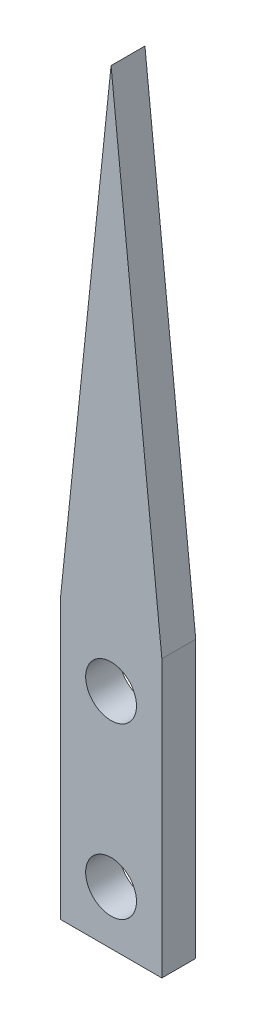
ISO-10303-21;
HEADER;
FILE_DESCRIPTION(('STEP AP214'),'2;1');
FILE_NAME('part.step','',(''),(''),'','','');
FILE_SCHEMA(('AUTOMOTIVE_DESIGN { 1 0 10303 214 1 1 1 1 }'));
ENDSEC;
DATA;
#1=APPLICATION_CONTEXT('core data for automotive mechanical design processes');
#2=APPLICATION_PROTOCOL_DEFINITION('international standard','automotive_design',2000,#1);
#3=PRODUCT_CONTEXT('',#1,'mechanical');
#4=PRODUCT('Part','Part','',(#3));
#5=PRODUCT_RELATED_PRODUCT_CATEGORY('part','',(#4));
#6=PRODUCT_DEFINITION_FORMATION('','',#4);
#7=PRODUCT_DEFINITION_CONTEXT('part definition',#1,'design');
#8=PRODUCT_DEFINITION('design','',#6,#7);
#9=PRODUCT_DEFINITION_SHAPE('','',#8);
#10=(LENGTH_UNIT() NAMED_UNIT(*) SI_UNIT(.MILLI.,.METRE.));
#11=(NAMED_UNIT(*) PLANE_ANGLE_UNIT() SI_UNIT($,.RADIAN.));
#12=(NAMED_UNIT(*) SI_UNIT($,.STERADIAN.) SOLID_ANGLE_UNIT());
#13=UNCERTAINTY_MEASURE_WITH_UNIT(LENGTH_MEASURE(1.E-05),#10,'distance_accuracy_value','');
#14=(GEOMETRIC_REPRESENTATION_CONTEXT(3) GLOBAL_UNCERTAINTY_ASSIGNED_CONTEXT((#13)) GLOBAL_UNIT_ASSIGNED_CONTEXT((#10,
#11,#12)) REPRESENTATION_CONTEXT('',''));
#15=CARTESIAN_POINT('',(0.,0.,0.));
#16=DIRECTION('',(0.,0.,1.));
#17=DIRECTION('',(1.,0.,0.));
#18=AXIS2_PLACEMENT_3D('',#15,#16,#17);
#19=CARTESIAN_POINT('',(0.,0.,2.));
#20=DIRECTION('',(0.,0.,-1.));
#21=DIRECTION('',(-1.,0.,0.));
#22=AXIS2_PLACEMENT_3D('',#19,#20,#21);
#23=PLANE('',#22);
#24=DIRECTION('',(-0.103478750023538,-0.994631664634485,0.));
#25=VECTOR('',#24,1.);
#26=CARTESIAN_POINT('',(0.,32.,2.));
#27=LINE('',#26,#25);
#28=CARTESIAN_POINT('',(0.,32.,2.));
#29=VERTEX_POINT('',#28);
#30=CARTESIAN_POINT('',(-3.,3.1641762852305,2.));
#31=VERTEX_POINT('',#30);
#32=EDGE_CURVE('E117',#29,#31,#27,.T.);
#33=ORIENTED_EDGE('',*,*,#32,.T.);
#34=DIRECTION('',(0.,-1.,0.));
#35=VECTOR('',#34,1.);
#36=CARTESIAN_POINT('',(-3.,3.1641762852305,2.));
#37=LINE('',#36,#35);
#38=CARTESIAN_POINT('',(-3.,-13.1641762852305,2.));
#39=VERTEX_POINT('',#38);
#40=EDGE_CURVE('E84',#31,#39,#37,.T.);
#41=ORIENTED_EDGE('',*,*,#40,.T.);
#42=DIRECTION('',(1.,0.,0.));
#43=VECTOR('',#42,1.);
#44=CARTESIAN_POINT('',(3.,-13.1641762852305,2.));
#45=LINE('',#44,#43);
#46=CARTESIAN_POINT('',(3.,-13.1641762852305,2.));
#47=VERTEX_POINT('',#46);
#48=EDGE_CURVE('E88',#39,#47,#45,.T.);
#49=ORIENTED_EDGE('',*,*,#48,.T.);
#50=DIRECTION('',(0.,1.,0.));
#51=VECTOR('',#50,1.);
#52=CARTESIAN_POINT('',(3.,3.16417628523051,2.));
#53=LINE('',#52,#51);
#54=CARTESIAN_POINT('',(3.,3.16417628523051,2.));
#55=VERTEX_POINT('',#54);
#56=EDGE_CURVE('E92',#47,#55,#53,.T.);
#57=ORIENTED_EDGE('',*,*,#56,.T.);
#58=DIRECTION('',(-0.103478750023538,0.994631664634485,0.));
#59=VECTOR('',#58,1.);
#60=CARTESIAN_POINT('',(3.,3.16417628523051,2.));
#61=LINE('',#60,#59);
#62=EDGE_CURVE('E50',#55,#29,#61,.T.);
#63=ORIENTED_EDGE('',*,*,#62,.T.);
#64=EDGE_LOOP('',(#33,#41,#49,#57,#63));
#65=FACE_BOUND('',#64,.T.);
#66=CARTESIAN_POINT('',(0.,0.,2.));
#67=DIRECTION('',(0.,0.,1.));
#68=DIRECTION('',(1.,0.,0.));
#69=AXIS2_PLACEMENT_3D('',#66,#67,#68);
#70=CIRCLE('',#69,1.5);
#71=CARTESIAN_POINT('',(1.5,0.,2.));
#72=VERTEX_POINT('',#71);
#73=EDGE_CURVE('E112',#72,#72,#70,.T.);
#74=ORIENTED_EDGE('',*,*,#73,.F.);
#75=EDGE_LOOP('',(#74));
#76=FACE_BOUND('',#75,.T.);
#77=CARTESIAN_POINT('',(0.,-10.,2.));
#78=DIRECTION('',(0.,0.,1.));
#79=DIRECTION('',(1.,0.,0.));
#80=AXIS2_PLACEMENT_3D('',#77,#78,#79);
#81=CIRCLE('',#80,1.5);
#82=CARTESIAN_POINT('',(1.5,-10.,2.));
#83=VERTEX_POINT('',#82);
#84=EDGE_CURVE('E153',#83,#83,#81,.T.);
#85=ORIENTED_EDGE('',*,*,#84,.F.);
#86=EDGE_LOOP('',(#85));
#87=FACE_BOUND('',#86,.T.);
#88=ADVANCED_FACE('F33',(#65,#76,#87),#23,.F.);
#89=CARTESIAN_POINT('',(0.,0.,0.));
#90=DIRECTION('',(0.,0.,-1.));
#91=DIRECTION('',(-1.,0.,0.));
#92=AXIS2_PLACEMENT_3D('',#89,#90,#91);
#93=PLANE('',#92);
#94=CARTESIAN_POINT('',(0.,0.,0.));
#95=DIRECTION('',(0.,0.,1.));
#96=DIRECTION('',(1.,0.,0.));
#97=AXIS2_PLACEMENT_3D('',#94,#95,#96);
#98=CIRCLE('',#97,1.5);
#99=CARTESIAN_POINT('',(1.5,0.,0.));
#100=VERTEX_POINT('',#99);
#101=EDGE_CURVE('E158',#100,#100,#98,.T.);
#102=ORIENTED_EDGE('',*,*,#101,.T.);
#103=EDGE_LOOP('',(#102));
#104=FACE_BOUND('',#103,.T.);
#105=DIRECTION('',(-0.103478750023538,-0.994631664634485,0.));
#106=VECTOR('',#105,1.);
#107=CARTESIAN_POINT('',(0.,32.,0.));
#108=LINE('',#107,#106);
#109=CARTESIAN_POINT('',(0.,32.,0.));
#110=VERTEX_POINT('',#109);
#111=CARTESIAN_POINT('',(-3.,3.1641762852305,0.));
#112=VERTEX_POINT('',#111);
#113=EDGE_CURVE('E108',#110,#112,#108,.T.);
#114=ORIENTED_EDGE('',*,*,#113,.F.);
#115=DIRECTION('',(-0.103478750023538,0.994631664634485,0.));
#116=VECTOR('',#115,1.);
#117=CARTESIAN_POINT('',(3.,3.16417628523051,0.));
#118=LINE('',#117,#116);
#119=CARTESIAN_POINT('',(3.,3.16417628523051,0.));
#120=VERTEX_POINT('',#119);
#121=EDGE_CURVE('E76',#120,#110,#118,.T.);
#122=ORIENTED_EDGE('',*,*,#121,.F.);
#123=DIRECTION('',(0.,1.,0.));
#124=VECTOR('',#123,1.);
#125=CARTESIAN_POINT('',(3.,3.16417628523051,0.));
#126=LINE('',#125,#124);
#127=CARTESIAN_POINT('',(3.,-13.1641762852305,0.));
#128=VERTEX_POINT('',#127);
#129=EDGE_CURVE('E70',#128,#120,#126,.T.);
#130=ORIENTED_EDGE('',*,*,#129,.F.);
#131=DIRECTION('',(1.,0.,0.));
#132=VECTOR('',#131,1.);
#133=CARTESIAN_POINT('',(3.,-13.1641762852305,0.));
#134=LINE('',#133,#132);
#135=CARTESIAN_POINT('',(-3.,-13.1641762852305,0.));
#136=VERTEX_POINT('',#135);
#137=EDGE_CURVE('E99',#136,#128,#134,.T.);
#138=ORIENTED_EDGE('',*,*,#137,.F.);
#139=DIRECTION('',(0.,-1.,0.));
#140=VECTOR('',#139,1.);
#141=CARTESIAN_POINT('',(-3.,3.1641762852305,0.));
#142=LINE('',#141,#140);
#143=EDGE_CURVE('E111',#112,#136,#142,.T.);
#144=ORIENTED_EDGE('',*,*,#143,.F.);
#145=EDGE_LOOP('',(#114,#122,#130,#138,#144));
#146=FACE_BOUND('',#145,.T.);
#147=CARTESIAN_POINT('',(0.,-10.,0.));
#148=DIRECTION('',(0.,0.,1.));
#149=DIRECTION('',(1.,0.,0.));
#150=AXIS2_PLACEMENT_3D('',#147,#148,#149);
#151=CIRCLE('',#150,1.5);
#152=CARTESIAN_POINT('',(1.5,-10.,0.));
#153=VERTEX_POINT('',#152);
#154=EDGE_CURVE('E156',#153,#153,#151,.T.);
#155=ORIENTED_EDGE('',*,*,#154,.T.);
#156=EDGE_LOOP('',(#155));
#157=FACE_BOUND('',#156,.T.);
#158=ADVANCED_FACE('F121',(#104,#146,#157),#93,.T.);
#159=CARTESIAN_POINT('',(0.,32.,2.));
#160=DIRECTION('',(0.994631664634485,-0.103478750023538,0.));
#161=DIRECTION('',(0.103478750023538,0.994631664634485,0.));
#162=AXIS2_PLACEMENT_3D('',#159,#160,#161);
#163=PLANE('',#162);
#164=ORIENTED_EDGE('',*,*,#113,.T.);
#165=DIRECTION('',(0.,0.,-1.));
#166=VECTOR('',#165,1.);
#167=CARTESIAN_POINT('',(-3.,3.1641762852305,2.));
#168=LINE('',#167,#166);
#169=EDGE_CURVE('E11',#31,#112,#168,.T.);
#170=ORIENTED_EDGE('',*,*,#169,.F.);
#171=ORIENTED_EDGE('',*,*,#32,.F.);
#172=DIRECTION('',(0.,0.,-1.));
#173=VECTOR('',#172,1.);
#174=CARTESIAN_POINT('',(0.,32.,2.));
#175=LINE('',#174,#173);
#176=EDGE_CURVE('E104',#29,#110,#175,.T.);
#177=ORIENTED_EDGE('',*,*,#176,.T.);
#178=EDGE_LOOP('',(#164,#170,#171,#177));
#179=FACE_BOUND('',#178,.T.);
#180=ADVANCED_FACE('F35',(#179),#163,.F.);
#181=CARTESIAN_POINT('',(-3.,3.1641762852305,2.));
#182=DIRECTION('',(1.,0.,0.));
#183=DIRECTION('',(0.,1.,0.));
#184=AXIS2_PLACEMENT_3D('',#181,#182,#183);
#185=PLANE('',#184);
#186=ORIENTED_EDGE('',*,*,#143,.T.);
#187=DIRECTION('',(0.,0.,-1.));
#188=VECTOR('',#187,1.);
#189=CARTESIAN_POINT('',(-3.,-13.1641762852305,2.));
#190=LINE('',#189,#188);
#191=EDGE_CURVE('E42',#39,#136,#190,.T.);
#192=ORIENTED_EDGE('',*,*,#191,.F.);
#193=ORIENTED_EDGE('',*,*,#40,.F.);
#194=ORIENTED_EDGE('',*,*,#169,.T.);
#195=EDGE_LOOP('',(#186,#192,#193,#194));
#196=FACE_BOUND('',#195,.T.);
#197=ADVANCED_FACE('F192',(#196),#185,.F.);
#198=CARTESIAN_POINT('',(3.,-13.1641762852305,2.));
#199=DIRECTION('',(0.,1.,0.));
#200=DIRECTION('',(-1.,0.,0.));
#201=AXIS2_PLACEMENT_3D('',#198,#199,#200);
#202=PLANE('',#201);
#203=ORIENTED_EDGE('',*,*,#137,.T.);
#204=DIRECTION('',(0.,0.,-1.));
#205=VECTOR('',#204,1.);
#206=CARTESIAN_POINT('',(3.,-13.1641762852305,2.));
#207=LINE('',#206,#205);
#208=EDGE_CURVE('E96',#47,#128,#207,.T.);
#209=ORIENTED_EDGE('',*,*,#208,.F.);
#210=ORIENTED_EDGE('',*,*,#48,.F.);
#211=ORIENTED_EDGE('',*,*,#191,.T.);
#212=EDGE_LOOP('',(#203,#209,#210,#211));
#213=FACE_BOUND('',#212,.T.);
#214=ADVANCED_FACE('F97',(#213),#202,.F.);
#215=CARTESIAN_POINT('',(3.,3.16417628523051,2.));
#216=DIRECTION('',(-1.,0.,0.));
#217=DIRECTION('',(0.,-1.,0.));
#218=AXIS2_PLACEMENT_3D('',#215,#216,#217);
#219=PLANE('',#218);
#220=ORIENTED_EDGE('',*,*,#129,.T.);
#221=DIRECTION('',(0.,0.,-1.));
#222=VECTOR('',#221,1.);
#223=CARTESIAN_POINT('',(3.,3.16417628523051,2.));
#224=LINE('',#223,#222);
#225=EDGE_CURVE('E100',#55,#120,#224,.T.);
#226=ORIENTED_EDGE('',*,*,#225,.F.);
#227=ORIENTED_EDGE('',*,*,#56,.F.);
#228=ORIENTED_EDGE('',*,*,#208,.T.);
#229=EDGE_LOOP('',(#220,#226,#227,#228));
#230=FACE_BOUND('',#229,.T.);
#231=ADVANCED_FACE('F102',(#230),#219,.F.);
#232=CARTESIAN_POINT('',(3.,3.16417628523051,2.));
#233=DIRECTION('',(-0.994631664634485,-0.103478750023538,0.));
#234=DIRECTION('',(0.103478750023538,-0.994631664634485,0.));
#235=AXIS2_PLACEMENT_3D('',#232,#233,#234);
#236=PLANE('',#235);
#237=ORIENTED_EDGE('',*,*,#121,.T.);
#238=ORIENTED_EDGE('',*,*,#176,.F.);
#239=ORIENTED_EDGE('',*,*,#62,.F.);
#240=ORIENTED_EDGE('',*,*,#225,.T.);
#241=EDGE_LOOP('',(#237,#238,#239,#240));
#242=FACE_BOUND('',#241,.T.);
#243=ADVANCED_FACE('F126',(#242),#236,.F.);
#244=CARTESIAN_POINT('',(0.,0.,2.));
#245=DIRECTION('',(0.,0.,-1.));
#246=DIRECTION('',(-1.,0.,0.));
#247=AXIS2_PLACEMENT_3D('',#244,#245,#246);
#248=CYLINDRICAL_SURFACE('',#247,1.5);
#249=ORIENTED_EDGE('',*,*,#73,.T.);
#250=EDGE_LOOP('',(#249));
#251=FACE_BOUND('',#250,.T.);
#252=ORIENTED_EDGE('',*,*,#101,.F.);
#253=EDGE_LOOP('',(#252));
#254=FACE_BOUND('',#253,.T.);
#255=ADVANCED_FACE('F128',(#251,#254),#248,.F.);
#256=CARTESIAN_POINT('',(0.,-10.,2.));
#257=DIRECTION('',(0.,0.,-1.));
#258=DIRECTION('',(-1.,0.,0.));
#259=AXIS2_PLACEMENT_3D('',#256,#257,#258);
#260=CYLINDRICAL_SURFACE('',#259,1.5);
#261=ORIENTED_EDGE('',*,*,#84,.T.);
#262=EDGE_LOOP('',(#261));
#263=FACE_BOUND('',#262,.T.);
#264=ORIENTED_EDGE('',*,*,#154,.F.);
#265=EDGE_LOOP('',(#264));
#266=FACE_BOUND('',#265,.T.);
#267=ADVANCED_FACE('F134',(#263,#266),#260,.F.);
#268=CLOSED_SHELL('',(#88,#158,#180,#197,#214,#231,#243,#255,#267));
#269=MANIFOLD_SOLID_BREP('B2',#268);
#270=ADVANCED_BREP_SHAPE_REPRESENTATION('',(#18,#269),#14);
#271=SHAPE_DEFINITION_REPRESENTATION(#9,#270);
ENDSEC;
END-ISO-10303-21;
